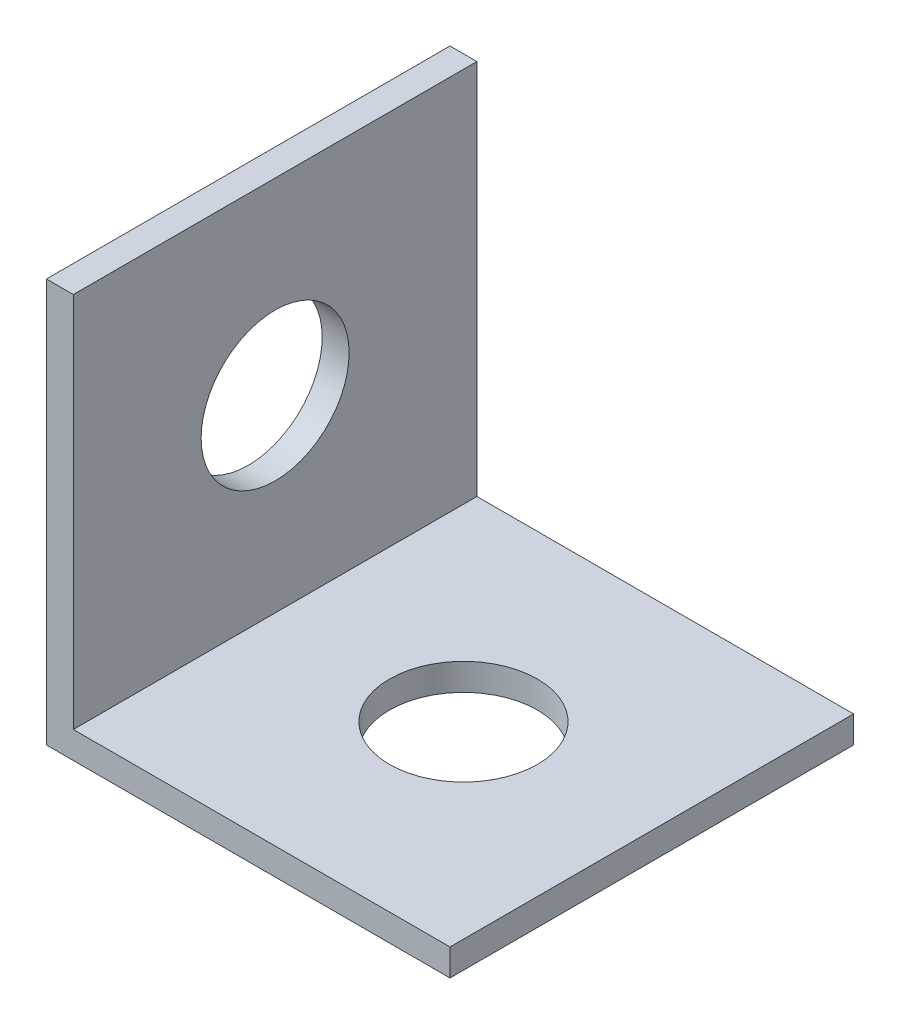
ISO-10303-21;
HEADER;
FILE_DESCRIPTION(('STEP AP214'),'2;1');
FILE_NAME('part.step','',(''),(''),'','','');
FILE_SCHEMA(('AUTOMOTIVE_DESIGN { 1 0 10303 214 1 1 1 1 }'));
ENDSEC;
DATA;
#1=APPLICATION_CONTEXT('core data for automotive mechanical design processes');
#2=APPLICATION_PROTOCOL_DEFINITION('international standard','automotive_design',2000,#1);
#3=PRODUCT_CONTEXT('',#1,'mechanical');
#4=PRODUCT('Part','Part','',(#3));
#5=PRODUCT_RELATED_PRODUCT_CATEGORY('part','',(#4));
#6=PRODUCT_DEFINITION_FORMATION('','',#4);
#7=PRODUCT_DEFINITION_CONTEXT('part definition',#1,'design');
#8=PRODUCT_DEFINITION('design','',#6,#7);
#9=PRODUCT_DEFINITION_SHAPE('','',#8);
#10=(LENGTH_UNIT() NAMED_UNIT(*) SI_UNIT(.MILLI.,.METRE.));
#11=(NAMED_UNIT(*) PLANE_ANGLE_UNIT() SI_UNIT($,.RADIAN.));
#12=(NAMED_UNIT(*) SI_UNIT($,.STERADIAN.) SOLID_ANGLE_UNIT());
#13=UNCERTAINTY_MEASURE_WITH_UNIT(LENGTH_MEASURE(1.E-05),#10,'distance_accuracy_value','');
#14=(GEOMETRIC_REPRESENTATION_CONTEXT(3) GLOBAL_UNCERTAINTY_ASSIGNED_CONTEXT((#13)) GLOBAL_UNIT_ASSIGNED_CONTEXT((#10,
#11,#12)) REPRESENTATION_CONTEXT('',''));
#15=CARTESIAN_POINT('',(0.,0.,0.));
#16=DIRECTION('',(0.,0.,1.));
#17=DIRECTION('',(1.,0.,0.));
#18=AXIS2_PLACEMENT_3D('',#15,#16,#17);
#19=CARTESIAN_POINT('',(15.,0.,15.));
#20=DIRECTION('',(0.,1.,0.));
#21=DIRECTION('',(-1.,0.,0.));
#22=AXIS2_PLACEMENT_3D('',#19,#20,#21);
#23=PLANE('',#22);
#24=CARTESIAN_POINT('',(8.,0.,7.5));
#25=DIRECTION('',(0.,-1.,0.));
#26=DIRECTION('',(1.,0.,0.));
#27=AXIS2_PLACEMENT_3D('',#24,#25,#26);
#28=CIRCLE('',#27,2.75);
#29=CARTESIAN_POINT('',(10.75,0.,7.5));
#30=VERTEX_POINT('',#29);
#31=EDGE_CURVE('E161',#30,#30,#28,.T.);
#32=ORIENTED_EDGE('',*,*,#31,.F.);
#33=EDGE_LOOP('',(#32));
#34=FACE_BOUND('',#33,.T.);
#35=DIRECTION('',(1.,0.,0.));
#36=VECTOR('',#35,1.);
#37=CARTESIAN_POINT('',(15.,0.,0.));
#38=LINE('',#37,#36);
#39=CARTESIAN_POINT('',(0.,0.,0.));
#40=VERTEX_POINT('',#39);
#41=CARTESIAN_POINT('',(15.,0.,0.));
#42=VERTEX_POINT('',#41);
#43=EDGE_CURVE('E117',#40,#42,#38,.T.);
#44=ORIENTED_EDGE('',*,*,#43,.T.);
#45=DIRECTION('',(0.,0.,-1.));
#46=VECTOR('',#45,1.);
#47=CARTESIAN_POINT('',(15.,0.,15.));
#48=LINE('',#47,#46);
#49=CARTESIAN_POINT('',(15.,0.,15.));
#50=VERTEX_POINT('',#49);
#51=EDGE_CURVE('E11',#50,#42,#48,.T.);
#52=ORIENTED_EDGE('',*,*,#51,.F.);
#53=DIRECTION('',(1.,0.,0.));
#54=VECTOR('',#53,1.);
#55=CARTESIAN_POINT('',(15.,0.,15.));
#56=LINE('',#55,#54);
#57=CARTESIAN_POINT('',(0.,0.,15.));
#58=VERTEX_POINT('',#57);
#59=EDGE_CURVE('E127',#58,#50,#56,.T.);
#60=ORIENTED_EDGE('',*,*,#59,.F.);
#61=DIRECTION('',(0.,0.,-1.));
#62=VECTOR('',#61,1.);
#63=CARTESIAN_POINT('',(0.,0.,15.));
#64=LINE('',#63,#62);
#65=EDGE_CURVE('E113',#58,#40,#64,.T.);
#66=ORIENTED_EDGE('',*,*,#65,.T.);
#67=EDGE_LOOP('',(#44,#52,#60,#66));
#68=FACE_BOUND('',#67,.T.);
#69=ADVANCED_FACE('F32',(#34,#68),#23,.F.);
#70=CARTESIAN_POINT('',(15.,1.,15.));
#71=DIRECTION('',(-1.,0.,0.));
#72=DIRECTION('',(0.,0.,1.));
#73=AXIS2_PLACEMENT_3D('',#70,#71,#72);
#74=PLANE('',#73);
#75=DIRECTION('',(0.,1.,0.));
#76=VECTOR('',#75,1.);
#77=CARTESIAN_POINT('',(15.,1.,0.));
#78=LINE('',#77,#76);
#79=CARTESIAN_POINT('',(15.,1.,0.));
#80=VERTEX_POINT('',#79);
#81=EDGE_CURVE('E120',#42,#80,#78,.T.);
#82=ORIENTED_EDGE('',*,*,#81,.T.);
#83=DIRECTION('',(0.,0.,-1.));
#84=VECTOR('',#83,1.);
#85=CARTESIAN_POINT('',(15.,1.,15.));
#86=LINE('',#85,#84);
#87=CARTESIAN_POINT('',(15.,1.,15.));
#88=VERTEX_POINT('',#87);
#89=EDGE_CURVE('E41',#88,#80,#86,.T.);
#90=ORIENTED_EDGE('',*,*,#89,.F.);
#91=DIRECTION('',(0.,1.,0.));
#92=VECTOR('',#91,1.);
#93=CARTESIAN_POINT('',(15.,1.,15.));
#94=LINE('',#93,#92);
#95=EDGE_CURVE('E86',#50,#88,#94,.T.);
#96=ORIENTED_EDGE('',*,*,#95,.F.);
#97=ORIENTED_EDGE('',*,*,#51,.T.);
#98=EDGE_LOOP('',(#82,#90,#96,#97));
#99=FACE_BOUND('',#98,.T.);
#100=ADVANCED_FACE('F154',(#99),#74,.F.);
#101=CARTESIAN_POINT('',(1.,1.,15.));
#102=DIRECTION('',(0.,-1.,0.));
#103=DIRECTION('',(1.,0.,0.));
#104=AXIS2_PLACEMENT_3D('',#101,#102,#103);
#105=PLANE('',#104);
#106=CARTESIAN_POINT('',(8.,1.,7.5));
#107=DIRECTION('',(0.,-1.,0.));
#108=DIRECTION('',(1.,0.,0.));
#109=AXIS2_PLACEMENT_3D('',#106,#107,#108);
#110=CIRCLE('',#109,2.75);
#111=CARTESIAN_POINT('',(10.75,1.,7.5));
#112=VERTEX_POINT('',#111);
#113=EDGE_CURVE('E35',#112,#112,#110,.T.);
#114=ORIENTED_EDGE('',*,*,#113,.T.);
#115=EDGE_LOOP('',(#114));
#116=FACE_BOUND('',#115,.T.);
#117=DIRECTION('',(-1.,0.,0.));
#118=VECTOR('',#117,1.);
#119=CARTESIAN_POINT('',(1.,1.,0.));
#120=LINE('',#119,#118);
#121=CARTESIAN_POINT('',(1.,1.,0.));
#122=VERTEX_POINT('',#121);
#123=EDGE_CURVE('E122',#80,#122,#120,.T.);
#124=ORIENTED_EDGE('',*,*,#123,.T.);
#125=DIRECTION('',(0.,0.,-1.));
#126=VECTOR('',#125,1.);
#127=CARTESIAN_POINT('',(1.,1.,15.));
#128=LINE('',#127,#126);
#129=CARTESIAN_POINT('',(1.,1.,15.));
#130=VERTEX_POINT('',#129);
#131=EDGE_CURVE('E108',#130,#122,#128,.T.);
#132=ORIENTED_EDGE('',*,*,#131,.F.);
#133=DIRECTION('',(-1.,0.,0.));
#134=VECTOR('',#133,1.);
#135=CARTESIAN_POINT('',(1.,1.,15.));
#136=LINE('',#135,#134);
#137=EDGE_CURVE('E99',#88,#130,#136,.T.);
#138=ORIENTED_EDGE('',*,*,#137,.F.);
#139=ORIENTED_EDGE('',*,*,#89,.T.);
#140=EDGE_LOOP('',(#124,#132,#138,#139));
#141=FACE_BOUND('',#140,.T.);
#142=ADVANCED_FACE('F134',(#116,#141),#105,.F.);
#143=CARTESIAN_POINT('',(0.999999999999997,15.,15.));
#144=DIRECTION('',(-1.,0.,0.));
#145=DIRECTION('',(0.,-1.,0.));
#146=AXIS2_PLACEMENT_3D('',#143,#144,#145);
#147=PLANE('',#146);
#148=CARTESIAN_POINT('',(0.999999999999999,8.,7.5));
#149=DIRECTION('',(1.,0.,0.));
#150=DIRECTION('',(0.,1.,0.));
#151=AXIS2_PLACEMENT_3D('',#148,#149,#150);
#152=CIRCLE('',#151,2.75);
#153=CARTESIAN_POINT('',(0.999999999999998,10.75,7.5));
#154=VERTEX_POINT('',#153);
#155=EDGE_CURVE('E166',#154,#154,#152,.T.);
#156=ORIENTED_EDGE('',*,*,#155,.F.);
#157=EDGE_LOOP('',(#156));
#158=FACE_BOUND('',#157,.T.);
#159=DIRECTION('',(0.,1.,0.));
#160=VECTOR('',#159,1.);
#161=CARTESIAN_POINT('',(0.999999999999997,15.,0.));
#162=LINE('',#161,#160);
#163=CARTESIAN_POINT('',(0.999999999999997,15.,0.));
#164=VERTEX_POINT('',#163);
#165=EDGE_CURVE('E107',#122,#164,#162,.T.);
#166=ORIENTED_EDGE('',*,*,#165,.T.);
#167=DIRECTION('',(0.,0.,-1.));
#168=VECTOR('',#167,1.);
#169=CARTESIAN_POINT('',(0.999999999999997,15.,15.));
#170=LINE('',#169,#168);
#171=CARTESIAN_POINT('',(0.999999999999997,15.,15.));
#172=VERTEX_POINT('',#171);
#173=EDGE_CURVE('E104',#172,#164,#170,.T.);
#174=ORIENTED_EDGE('',*,*,#173,.F.);
#175=DIRECTION('',(0.,1.,0.));
#176=VECTOR('',#175,1.);
#177=CARTESIAN_POINT('',(0.999999999999997,15.,15.));
#178=LINE('',#177,#176);
#179=EDGE_CURVE('E93',#130,#172,#178,.T.);
#180=ORIENTED_EDGE('',*,*,#179,.F.);
#181=ORIENTED_EDGE('',*,*,#131,.T.);
#182=EDGE_LOOP('',(#166,#174,#180,#181));
#183=FACE_BOUND('',#182,.T.);
#184=ADVANCED_FACE('F105',(#158,#183),#147,.F.);
#185=CARTESIAN_POINT('',(0.,15.,15.));
#186=DIRECTION('',(0.,-1.,0.));
#187=DIRECTION('',(0.,0.,-1.));
#188=AXIS2_PLACEMENT_3D('',#185,#186,#187);
#189=PLANE('',#188);
#190=DIRECTION('',(-1.,0.,0.));
#191=VECTOR('',#190,1.);
#192=CARTESIAN_POINT('',(0.,15.,0.));
#193=LINE('',#192,#191);
#194=CARTESIAN_POINT('',(0.,15.,0.));
#195=VERTEX_POINT('',#194);
#196=EDGE_CURVE('E72',#164,#195,#193,.T.);
#197=ORIENTED_EDGE('',*,*,#196,.T.);
#198=DIRECTION('',(0.,0.,-1.));
#199=VECTOR('',#198,1.);
#200=CARTESIAN_POINT('',(0.,15.,15.));
#201=LINE('',#200,#199);
#202=CARTESIAN_POINT('',(0.,15.,15.));
#203=VERTEX_POINT('',#202);
#204=EDGE_CURVE('E109',#203,#195,#201,.T.);
#205=ORIENTED_EDGE('',*,*,#204,.F.);
#206=DIRECTION('',(-1.,0.,0.));
#207=VECTOR('',#206,1.);
#208=CARTESIAN_POINT('',(0.,15.,15.));
#209=LINE('',#208,#207);
#210=EDGE_CURVE('E97',#172,#203,#209,.T.);
#211=ORIENTED_EDGE('',*,*,#210,.F.);
#212=ORIENTED_EDGE('',*,*,#173,.T.);
#213=EDGE_LOOP('',(#197,#205,#211,#212));
#214=FACE_BOUND('',#213,.T.);
#215=ADVANCED_FACE('F111',(#214),#189,.F.);
#216=CARTESIAN_POINT('',(0.,0.,15.));
#217=DIRECTION('',(1.,0.,0.));
#218=DIRECTION('',(0.,1.,0.));
#219=AXIS2_PLACEMENT_3D('',#216,#217,#218);
#220=PLANE('',#219);
#221=CARTESIAN_POINT('',(0.,8.,7.5));
#222=DIRECTION('',(1.,0.,0.));
#223=DIRECTION('',(0.,1.,0.));
#224=AXIS2_PLACEMENT_3D('',#221,#222,#223);
#225=CIRCLE('',#224,2.75);
#226=CARTESIAN_POINT('',(0.,10.75,7.5));
#227=VERTEX_POINT('',#226);
#228=EDGE_CURVE('E163',#227,#227,#225,.T.);
#229=ORIENTED_EDGE('',*,*,#228,.T.);
#230=EDGE_LOOP('',(#229));
#231=FACE_BOUND('',#230,.T.);
#232=DIRECTION('',(0.,-1.,0.));
#233=VECTOR('',#232,1.);
#234=CARTESIAN_POINT('',(0.,0.,0.));
#235=LINE('',#234,#233);
#236=EDGE_CURVE('E78',#195,#40,#235,.T.);
#237=ORIENTED_EDGE('',*,*,#236,.T.);
#238=ORIENTED_EDGE('',*,*,#65,.F.);
#239=DIRECTION('',(0.,-1.,0.));
#240=VECTOR('',#239,1.);
#241=CARTESIAN_POINT('',(0.,0.,15.));
#242=LINE('',#241,#240);
#243=EDGE_CURVE('E49',#203,#58,#242,.T.);
#244=ORIENTED_EDGE('',*,*,#243,.F.);
#245=ORIENTED_EDGE('',*,*,#204,.T.);
#246=EDGE_LOOP('',(#237,#238,#244,#245));
#247=FACE_BOUND('',#246,.T.);
#248=ADVANCED_FACE('F141',(#231,#247),#220,.F.);
#249=CARTESIAN_POINT('',(0.,0.,15.));
#250=DIRECTION('',(0.,0.,-1.));
#251=DIRECTION('',(-1.,0.,0.));
#252=AXIS2_PLACEMENT_3D('',#249,#250,#251);
#253=PLANE('',#252);
#254=ORIENTED_EDGE('',*,*,#59,.T.);
#255=ORIENTED_EDGE('',*,*,#95,.T.);
#256=ORIENTED_EDGE('',*,*,#137,.T.);
#257=ORIENTED_EDGE('',*,*,#179,.T.);
#258=ORIENTED_EDGE('',*,*,#210,.T.);
#259=ORIENTED_EDGE('',*,*,#243,.T.);
#260=EDGE_LOOP('',(#254,#255,#256,#257,#258,#259));
#261=FACE_BOUND('',#260,.T.);
#262=ADVANCED_FACE('F95',(#261),#253,.F.);
#263=CARTESIAN_POINT('',(0.,0.,0.));
#264=DIRECTION('',(0.,0.,-1.));
#265=DIRECTION('',(-1.,0.,0.));
#266=AXIS2_PLACEMENT_3D('',#263,#264,#265);
#267=PLANE('',#266);
#268=ORIENTED_EDGE('',*,*,#43,.F.);
#269=ORIENTED_EDGE('',*,*,#236,.F.);
#270=ORIENTED_EDGE('',*,*,#196,.F.);
#271=ORIENTED_EDGE('',*,*,#165,.F.);
#272=ORIENTED_EDGE('',*,*,#123,.F.);
#273=ORIENTED_EDGE('',*,*,#81,.F.);
#274=EDGE_LOOP('',(#268,#269,#270,#271,#272,#273));
#275=FACE_BOUND('',#274,.T.);
#276=ADVANCED_FACE('F137',(#275),#267,.T.);
#277=CARTESIAN_POINT('',(8.,19.05,7.5));
#278=DIRECTION('',(0.,-1.,0.));
#279=DIRECTION('',(1.,0.,0.));
#280=AXIS2_PLACEMENT_3D('',#277,#278,#279);
#281=CYLINDRICAL_SURFACE('',#280,2.75);
#282=CARTESIAN_POINT('',(10.75,0.,7.5));
#283=CARTESIAN_POINT('',(10.75,0.0104166666666667,7.5));
#284=CARTESIAN_POINT('',(10.75,0.0208333333333333,7.5));
#285=CARTESIAN_POINT('',(10.75,0.0416666666666667,7.5));
#286=CARTESIAN_POINT('',(10.75,0.0520833333333334,7.5));
#287=CARTESIAN_POINT('',(10.75,0.0729166666666667,7.5));
#288=CARTESIAN_POINT('',(10.75,0.0833333333333334,7.5));
#289=CARTESIAN_POINT('',(10.75,0.104166666666667,7.5));
#290=CARTESIAN_POINT('',(10.75,0.114583333333333,7.5));
#291=CARTESIAN_POINT('',(10.75,0.135416666666667,7.5));
#292=CARTESIAN_POINT('',(10.75,0.145833333333333,7.5));
#293=CARTESIAN_POINT('',(10.75,0.166666666666667,7.5));
#294=CARTESIAN_POINT('',(10.75,0.177083333333333,7.5));
#295=CARTESIAN_POINT('',(10.75,0.197916666666667,7.5));
#296=CARTESIAN_POINT('',(10.75,0.208333333333334,7.5));
#297=CARTESIAN_POINT('',(10.75,0.229166666666667,7.5));
#298=CARTESIAN_POINT('',(10.75,0.239583333333334,7.5));
#299=CARTESIAN_POINT('',(10.75,0.260416666666667,7.5));
#300=CARTESIAN_POINT('',(10.75,0.270833333333334,7.5));
#301=CARTESIAN_POINT('',(10.75,0.291666666666667,7.5));
#302=CARTESIAN_POINT('',(10.75,0.302083333333334,7.5));
#303=CARTESIAN_POINT('',(10.75,0.322916666666667,7.5));
#304=CARTESIAN_POINT('',(10.75,0.333333333333334,7.5));
#305=CARTESIAN_POINT('',(10.75,0.354166666666667,7.5));
#306=CARTESIAN_POINT('',(10.75,0.364583333333334,7.5));
#307=CARTESIAN_POINT('',(10.75,0.385416666666667,7.5));
#308=CARTESIAN_POINT('',(10.75,0.395833333333334,7.5));
#309=CARTESIAN_POINT('',(10.75,0.416666666666667,7.5));
#310=CARTESIAN_POINT('',(10.75,0.427083333333334,7.5));
#311=CARTESIAN_POINT('',(10.75,0.447916666666667,7.5));
#312=CARTESIAN_POINT('',(10.75,0.458333333333334,7.5));
#313=CARTESIAN_POINT('',(10.75,0.479166666666667,7.5));
#314=CARTESIAN_POINT('',(10.75,0.489583333333334,7.5));
#315=CARTESIAN_POINT('',(10.75,0.510416666666667,7.5));
#316=CARTESIAN_POINT('',(10.75,0.520833333333334,7.5));
#317=CARTESIAN_POINT('',(10.75,0.541666666666667,7.5));
#318=CARTESIAN_POINT('',(10.75,0.552083333333334,7.5));
#319=CARTESIAN_POINT('',(10.75,0.572916666666667,7.5));
#320=CARTESIAN_POINT('',(10.75,0.583333333333334,7.5));
#321=CARTESIAN_POINT('',(10.75,0.604166666666667,7.5));
#322=CARTESIAN_POINT('',(10.75,0.614583333333334,7.5));
#323=CARTESIAN_POINT('',(10.75,0.635416666666667,7.5));
#324=CARTESIAN_POINT('',(10.75,0.645833333333334,7.5));
#325=CARTESIAN_POINT('',(10.75,0.666666666666667,7.5));
#326=CARTESIAN_POINT('',(10.75,0.677083333333334,7.5));
#327=CARTESIAN_POINT('',(10.75,0.697916666666667,7.5));
#328=CARTESIAN_POINT('',(10.75,0.708333333333334,7.5));
#329=CARTESIAN_POINT('',(10.75,0.729166666666667,7.5));
#330=CARTESIAN_POINT('',(10.75,0.739583333333334,7.5));
#331=CARTESIAN_POINT('',(10.75,0.760416666666667,7.5));
#332=CARTESIAN_POINT('',(10.75,0.770833333333334,7.5));
#333=CARTESIAN_POINT('',(10.75,0.791666666666667,7.5));
#334=CARTESIAN_POINT('',(10.75,0.802083333333334,7.5));
#335=CARTESIAN_POINT('',(10.75,0.822916666666667,7.5));
#336=CARTESIAN_POINT('',(10.75,0.833333333333334,7.5));
#337=CARTESIAN_POINT('',(10.75,0.854166666666667,7.5));
#338=CARTESIAN_POINT('',(10.75,0.864583333333334,7.5));
#339=CARTESIAN_POINT('',(10.75,0.885416666666668,7.5));
#340=CARTESIAN_POINT('',(10.75,0.895833333333334,7.5));
#341=CARTESIAN_POINT('',(10.75,0.916666666666668,7.5));
#342=CARTESIAN_POINT('',(10.75,0.927083333333334,7.5));
#343=CARTESIAN_POINT('',(10.75,0.947916666666668,7.5));
#344=CARTESIAN_POINT('',(10.75,0.958333333333334,7.5));
#345=CARTESIAN_POINT('',(10.75,0.979166666666668,7.5));
#346=CARTESIAN_POINT('',(10.75,0.989583333333334,7.5));
#347=CARTESIAN_POINT('',(10.75,1.,7.5));
#348=B_SPLINE_CURVE_WITH_KNOTS('',3,(#282,#283,#284,#285,#286,#287,#288,#289,#290,#291,#292,
#293,#294,#295,#296,#297,#298,#299,#300,#301,#302,#303,#304,#305,#306,#307,#308,#309,#310,#311,
#312,#313,#314,#315,#316,#317,#318,#319,#320,#321,#322,#323,#324,#325,#326,#327,#328,#329,#330,
#331,#332,#333,#334,#335,#336,#337,#338,#339,#340,#341,#342,#343,#344,#345,#346,#347),
.UNSPECIFIED.,.F.,.F.,(4,2,2,2,2,2,2,2,2,2,2,2,2,2,2,2,2,2,2,2,2,2,2,2,2,2,2,2,2,2,2,2,4),(0.,
0.03125,0.0625000000000001,0.0937500000000001,0.125,0.15625,0.1875,0.21875,0.25,0.28125,0.3125,
0.34375,0.375,0.40625,0.4375,0.46875,0.5,0.53125,0.5625,0.593750000000001,0.625000000000001,
0.656250000000001,0.687500000000001,0.718750000000001,0.750000000000001,0.781250000000001,
0.812500000000001,0.843750000000001,0.875000000000001,0.906250000000001,0.937500000000001,
0.968750000000001,1.),.UNSPECIFIED.);
#349=EDGE_CURVE('BSEAM187',#30,#112,#348,.T.);
#350=ORIENTED_EDGE('',*,*,#31,.T.);
#351=ORIENTED_EDGE('',*,*,#113,.F.);
#352=ORIENTED_EDGE('',*,*,#349,.T.);
#353=ORIENTED_EDGE('',*,*,#349,.F.);
#354=EDGE_LOOP('',(#350,#352,#351,#353));
#355=FACE_BOUND('',#354,.T.);
#356=ADVANCED_FACE('F187',(#355),#281,.F.);
#357=CARTESIAN_POINT('',(0.,8.,7.5));
#358=DIRECTION('',(1.,0.,0.));
#359=DIRECTION('',(0.,1.,0.));
#360=AXIS2_PLACEMENT_3D('',#357,#358,#359);
#361=CYLINDRICAL_SURFACE('',#360,2.75);
#362=ORIENTED_EDGE('',*,*,#228,.F.);
#363=EDGE_LOOP('',(#362));
#364=FACE_BOUND('',#363,.T.);
#365=ORIENTED_EDGE('',*,*,#155,.T.);
#366=EDGE_LOOP('',(#365));
#367=FACE_BOUND('',#366,.T.);
#368=ADVANCED_FACE('F174',(#364,#367),#361,.F.);
#369=CLOSED_SHELL('',(#69,#100,#142,#184,#215,#248,#262,#276,#356,#368));
#370=MANIFOLD_SOLID_BREP('B2',#369);
#371=ADVANCED_BREP_SHAPE_REPRESENTATION('',(#18,#370),#14);
#372=SHAPE_DEFINITION_REPRESENTATION(#9,#371);
ENDSEC;
END-ISO-10303-21;
